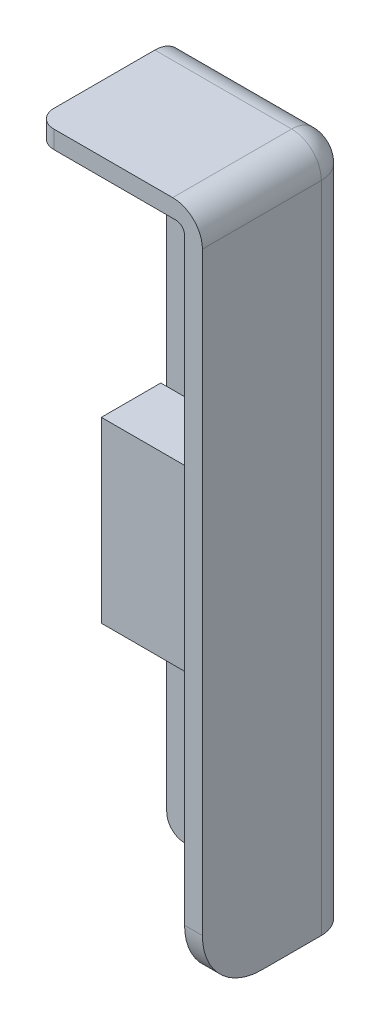
ISO-10303-21;
HEADER;
FILE_DESCRIPTION(('STEP AP214'),'2;1');
FILE_NAME('part.step','',(''),(''),'','','');
FILE_SCHEMA(('AUTOMOTIVE_DESIGN { 1 0 10303 214 1 1 1 1 }'));
ENDSEC;
DATA;
#1=APPLICATION_CONTEXT('core data for automotive mechanical design processes');
#2=APPLICATION_PROTOCOL_DEFINITION('international standard','automotive_design',2000,#1);
#3=PRODUCT_CONTEXT('',#1,'mechanical');
#4=PRODUCT('Part','Part','',(#3));
#5=PRODUCT_RELATED_PRODUCT_CATEGORY('part','',(#4));
#6=PRODUCT_DEFINITION_FORMATION('','',#4);
#7=PRODUCT_DEFINITION_CONTEXT('part definition',#1,'design');
#8=PRODUCT_DEFINITION('design','',#6,#7);
#9=PRODUCT_DEFINITION_SHAPE('','',#8);
#10=(LENGTH_UNIT() NAMED_UNIT(*) SI_UNIT(.MILLI.,.METRE.));
#11=(NAMED_UNIT(*) PLANE_ANGLE_UNIT() SI_UNIT($,.RADIAN.));
#12=(NAMED_UNIT(*) SI_UNIT($,.STERADIAN.) SOLID_ANGLE_UNIT());
#13=UNCERTAINTY_MEASURE_WITH_UNIT(LENGTH_MEASURE(1.E-05),#10,'distance_accuracy_value','');
#14=(GEOMETRIC_REPRESENTATION_CONTEXT(3) GLOBAL_UNCERTAINTY_ASSIGNED_CONTEXT((#13)) GLOBAL_UNIT_ASSIGNED_CONTEXT((#10,
#11,#12)) REPRESENTATION_CONTEXT('',''));
#15=CARTESIAN_POINT('',(0.,0.,0.));
#16=DIRECTION('',(0.,0.,1.));
#17=DIRECTION('',(1.,0.,0.));
#18=AXIS2_PLACEMENT_3D('',#15,#16,#17);
#19=CARTESIAN_POINT('',(11.,0.,0.));
#20=DIRECTION('',(1.,0.,0.));
#21=DIRECTION('',(0.,0.,-1.));
#22=AXIS2_PLACEMENT_3D('',#19,#20,#21);
#23=PLANE('',#22);
#24=CARTESIAN_POINT('',(11.,-42.9999999999999,1.49999999999996));
#25=DIRECTION('',(1.,0.,0.));
#26=DIRECTION('',(0.,0.,-1.));
#27=AXIS2_PLACEMENT_3D('',#24,#25,#26);
#28=CIRCLE('',#27,3.5);
#29=CARTESIAN_POINT('',(11.,-42.9999999999999,-2.00000000000004));
#30=VERTEX_POINT('',#29);
#31=EDGE_CURVE('E367',#30,#30,#28,.T.);
#32=ORIENTED_EDGE('',*,*,#31,.T.);
#33=EDGE_LOOP('',(#32));
#34=FACE_BOUND('',#33,.T.);
#35=DIRECTION('',(0.,-1.,0.));
#36=VECTOR('',#35,1.);
#37=CARTESIAN_POINT('',(11.,13.5,-6.50000000000002));
#38=LINE('',#37,#36);
#39=CARTESIAN_POINT('',(11.,-19.5,-6.50000000000002));
#40=VERTEX_POINT('',#39);
#41=CARTESIAN_POINT('',(11.,16.5,-6.50000000000002));
#42=VERTEX_POINT('',#41);
#43=EDGE_CURVE('E358',#40,#42,#38,.F.);
#44=ORIENTED_EDGE('',*,*,#43,.T.);
#45=DIRECTION('',(0.,0.,-1.));
#46=VECTOR('',#45,1.);
#47=CARTESIAN_POINT('',(11.,16.5,6.49999999999998));
#48=LINE('',#47,#46);
#49=CARTESIAN_POINT('',(11.,16.5,9.49999999999998));
#50=VERTEX_POINT('',#49);
#51=EDGE_CURVE('E360',#42,#50,#48,.F.);
#52=ORIENTED_EDGE('',*,*,#51,.T.);
#53=DIRECTION('',(0.,1.,0.));
#54=VECTOR('',#53,1.);
#55=CARTESIAN_POINT('',(11.,-16.5,9.49999999999998));
#56=LINE('',#55,#54);
#57=CARTESIAN_POINT('',(11.,-19.5,9.49999999999998));
#58=VERTEX_POINT('',#57);
#59=EDGE_CURVE('E354',#50,#58,#56,.F.);
#60=ORIENTED_EDGE('',*,*,#59,.T.);
#61=DIRECTION('',(0.,0.,1.));
#62=VECTOR('',#61,1.);
#63=CARTESIAN_POINT('',(11.,-19.5,-3.50000000000002));
#64=LINE('',#63,#62);
#65=EDGE_CURVE('E356',#58,#40,#64,.F.);
#66=ORIENTED_EDGE('',*,*,#65,.T.);
#67=EDGE_LOOP('',(#44,#52,#60,#66));
#68=FACE_BOUND('',#67,.T.);
#69=DIRECTION('',(0.,0.,-1.));
#70=VECTOR('',#69,1.);
#71=CARTESIAN_POINT('',(11.,-57.5,12.5));
#72=LINE('',#71,#70);
#73=CARTESIAN_POINT('',(11.,-57.5,2.49999999999999));
#74=VERTEX_POINT('',#73);
#75=CARTESIAN_POINT('',(11.,-57.5,-8.00000000000001));
#76=VERTEX_POINT('',#75);
#77=EDGE_CURVE('E241',#74,#76,#72,.T.);
#78=ORIENTED_EDGE('',*,*,#77,.F.);
#79=CARTESIAN_POINT('',(11.,-47.5,2.49999999999999));
#80=DIRECTION('',(1.,0.,0.));
#81=DIRECTION('',(0.,0.,-1.));
#82=AXIS2_PLACEMENT_3D('',#79,#80,#81);
#83=CIRCLE('',#82,10.);
#84=CARTESIAN_POINT('',(11.,-47.5,12.5));
#85=VERTEX_POINT('',#84);
#86=EDGE_CURVE('E327',#74,#85,#83,.F.);
#87=ORIENTED_EDGE('',*,*,#86,.T.);
#88=DIRECTION('',(0.,-1.,0.));
#89=VECTOR('',#88,1.);
#90=CARTESIAN_POINT('',(11.,-57.5,12.5));
#91=LINE('',#90,#89);
#92=CARTESIAN_POINT('',(11.,53.,12.5));
#93=VERTEX_POINT('',#92);
#94=EDGE_CURVE('E237',#93,#85,#91,.T.);
#95=ORIENTED_EDGE('',*,*,#94,.F.);
#96=DIRECTION('',(0.,0.,1.));
#97=VECTOR('',#96,1.);
#98=CARTESIAN_POINT('',(11.,53.,0.));
#99=LINE('',#98,#97);
#100=CARTESIAN_POINT('',(11.,53.,-8.00000000000001));
#101=VERTEX_POINT('',#100);
#102=EDGE_CURVE('E271',#93,#101,#99,.F.);
#103=ORIENTED_EDGE('',*,*,#102,.T.);
#104=DIRECTION('',(0.,1.,0.));
#105=VECTOR('',#104,1.);
#106=CARTESIAN_POINT('',(11.,0.,-8.00000000000001));
#107=LINE('',#106,#105);
#108=EDGE_CURVE('E273',#101,#76,#107,.F.);
#109=ORIENTED_EDGE('',*,*,#108,.T.);
#110=EDGE_LOOP('',(#78,#87,#95,#103,#109));
#111=FACE_BOUND('',#110,.T.);
#112=ADVANCED_FACE('F43',(#34,#68,#111),#23,.F.);
#113=CARTESIAN_POINT('',(14.,57.5,12.5));
#114=DIRECTION('',(0.,0.,-1.));
#115=DIRECTION('',(0.,1.,0.));
#116=AXIS2_PLACEMENT_3D('',#113,#114,#115);
#117=PLANE('',#116);
#118=DIRECTION('',(-1.,0.,0.));
#119=VECTOR('',#118,1.);
#120=CARTESIAN_POINT('',(14.,57.5,12.5));
#121=LINE('',#120,#119);
#122=CARTESIAN_POINT('',(9.,57.5,12.5));
#123=VERTEX_POINT('',#122);
#124=CARTESIAN_POINT('',(-11.,57.5,12.5));
#125=VERTEX_POINT('',#124);
#126=EDGE_CURVE('E262',#123,#125,#121,.T.);
#127=ORIENTED_EDGE('',*,*,#126,.T.);
#128=DIRECTION('',(0.,-1.,0.));
#129=VECTOR('',#128,1.);
#130=CARTESIAN_POINT('',(-11.,57.5,12.5));
#131=LINE('',#130,#129);
#132=CARTESIAN_POINT('',(-11.,54.5,12.5));
#133=VERTEX_POINT('',#132);
#134=EDGE_CURVE('E344',#125,#133,#131,.T.);
#135=ORIENTED_EDGE('',*,*,#134,.T.);
#136=DIRECTION('',(-1.,0.,0.));
#137=VECTOR('',#136,1.);
#138=CARTESIAN_POINT('',(128.140264587042,54.5,12.5));
#139=LINE('',#138,#137);
#140=CARTESIAN_POINT('',(9.49999999999999,54.5,12.5));
#141=VERTEX_POINT('',#140);
#142=EDGE_CURVE('E233',#141,#133,#139,.T.);
#143=ORIENTED_EDGE('',*,*,#142,.F.);
#144=CARTESIAN_POINT('',(9.49999999999999,53.,12.5));
#145=DIRECTION('',(0.,0.,-1.));
#146=DIRECTION('',(0.,1.,0.));
#147=AXIS2_PLACEMENT_3D('',#144,#145,#146);
#148=CIRCLE('',#147,1.5);
#149=EDGE_CURVE('E284',#141,#93,#148,.T.);
#150=ORIENTED_EDGE('',*,*,#149,.T.);
#151=ORIENTED_EDGE('',*,*,#94,.T.);
#152=DIRECTION('',(-1.,0.,0.));
#153=VECTOR('',#152,1.);
#154=CARTESIAN_POINT('',(14.,-47.5,12.5));
#155=LINE('',#154,#153);
#156=CARTESIAN_POINT('',(14.,-47.5,12.5));
#157=VERTEX_POINT('',#156);
#158=EDGE_CURVE('E329',#85,#157,#155,.F.);
#159=ORIENTED_EDGE('',*,*,#158,.T.);
#160=DIRECTION('',(0.,-1.,0.));
#161=VECTOR('',#160,1.);
#162=CARTESIAN_POINT('',(14.,57.5,12.5));
#163=LINE('',#162,#161);
#164=CARTESIAN_POINT('',(14.,52.5,12.5));
#165=VERTEX_POINT('',#164);
#166=EDGE_CURVE('E250',#165,#157,#163,.T.);
#167=ORIENTED_EDGE('',*,*,#166,.F.);
#168=CARTESIAN_POINT('',(9.,52.5,12.5));
#169=DIRECTION('',(0.,0.,-1.));
#170=DIRECTION('',(0.,1.,0.));
#171=AXIS2_PLACEMENT_3D('',#168,#169,#170);
#172=CIRCLE('',#171,5.);
#173=EDGE_CURVE('E310',#165,#123,#172,.F.);
#174=ORIENTED_EDGE('',*,*,#173,.T.);
#175=EDGE_LOOP('',(#127,#135,#143,#150,#151,#159,#167,#174));
#176=FACE_BOUND('',#175,.T.);
#177=ADVANCED_FACE('F395',(#176),#117,.F.);
#178=CARTESIAN_POINT('',(14.,-57.5,12.5));
#179=DIRECTION('',(0.,1.,0.));
#180=DIRECTION('',(0.,0.,1.));
#181=AXIS2_PLACEMENT_3D('',#178,#179,#180);
#182=PLANE('',#181);
#183=DIRECTION('',(-1.,0.,0.));
#184=VECTOR('',#183,1.);
#185=CARTESIAN_POINT('',(128.140264587042,-57.5,-9.50000000000001));
#186=LINE('',#185,#184);
#187=CARTESIAN_POINT('',(9.49999999999999,-57.5,-9.50000000000001));
#188=VERTEX_POINT('',#187);
#189=CARTESIAN_POINT('',(-11.,-57.5,-9.50000000000001));
#190=VERTEX_POINT('',#189);
#191=EDGE_CURVE('E240',#188,#190,#186,.T.);
#192=ORIENTED_EDGE('',*,*,#191,.T.);
#193=DIRECTION('',(0.,0.,-1.));
#194=VECTOR('',#193,1.);
#195=CARTESIAN_POINT('',(-11.,-57.5,12.5));
#196=LINE('',#195,#194);
#197=CARTESIAN_POINT('',(-11.,-57.5,-12.5));
#198=VERTEX_POINT('',#197);
#199=EDGE_CURVE('E333',#190,#198,#196,.T.);
#200=ORIENTED_EDGE('',*,*,#199,.T.);
#201=DIRECTION('',(-1.,0.,0.));
#202=VECTOR('',#201,1.);
#203=CARTESIAN_POINT('',(14.,-57.5,-12.5));
#204=LINE('',#203,#202);
#205=CARTESIAN_POINT('',(9.,-57.5,-12.5));
#206=VERTEX_POINT('',#205);
#207=EDGE_CURVE('E256',#206,#198,#204,.T.);
#208=ORIENTED_EDGE('',*,*,#207,.F.);
#209=CARTESIAN_POINT('',(9.,-57.5,-7.50000000000001));
#210=DIRECTION('',(0.,1.,0.));
#211=DIRECTION('',(0.,0.,1.));
#212=AXIS2_PLACEMENT_3D('',#209,#210,#211);
#213=CIRCLE('',#212,5.);
#214=CARTESIAN_POINT('',(14.,-57.5,-7.50000000000001));
#215=VERTEX_POINT('',#214);
#216=EDGE_CURVE('E312',#206,#215,#213,.F.);
#217=ORIENTED_EDGE('',*,*,#216,.T.);
#218=DIRECTION('',(0.,0.,-1.));
#219=VECTOR('',#218,1.);
#220=CARTESIAN_POINT('',(14.,-57.5,12.5));
#221=LINE('',#220,#219);
#222=CARTESIAN_POINT('',(14.,-57.5,2.49999999999999));
#223=VERTEX_POINT('',#222);
#224=EDGE_CURVE('E253',#223,#215,#221,.T.);
#225=ORIENTED_EDGE('',*,*,#224,.F.);
#226=DIRECTION('',(-1.,0.,0.));
#227=VECTOR('',#226,1.);
#228=CARTESIAN_POINT('',(14.,-57.5,2.49999999999999));
#229=LINE('',#228,#227);
#230=EDGE_CURVE('E315',#223,#74,#229,.T.);
#231=ORIENTED_EDGE('',*,*,#230,.T.);
#232=ORIENTED_EDGE('',*,*,#77,.T.);
#233=CARTESIAN_POINT('',(9.49999999999999,-57.5,-8.00000000000001));
#234=DIRECTION('',(0.,1.,0.));
#235=DIRECTION('',(0.,0.,1.));
#236=AXIS2_PLACEMENT_3D('',#233,#234,#235);
#237=CIRCLE('',#236,1.5);
#238=EDGE_CURVE('E280',#76,#188,#237,.T.);
#239=ORIENTED_EDGE('',*,*,#238,.T.);
#240=EDGE_LOOP('',(#192,#200,#208,#217,#225,#231,#232,#239));
#241=FACE_BOUND('',#240,.T.);
#242=ADVANCED_FACE('F405',(#241),#182,.F.);
#243=CARTESIAN_POINT('',(-14.,0.,0.));
#244=DIRECTION('',(1.,0.,0.));
#245=DIRECTION('',(0.,0.,-1.));
#246=AXIS2_PLACEMENT_3D('',#243,#244,#245);
#247=PLANE('',#246);
#248=DIRECTION('',(0.,1.,0.));
#249=VECTOR('',#248,1.);
#250=CARTESIAN_POINT('',(-14.,57.5,-12.5));
#251=LINE('',#250,#249);
#252=CARTESIAN_POINT('',(-14.,-54.5,-12.5));
#253=VERTEX_POINT('',#252);
#254=CARTESIAN_POINT('',(-14.,52.5,-12.5));
#255=VERTEX_POINT('',#254);
#256=EDGE_CURVE('E243',#253,#255,#251,.T.);
#257=ORIENTED_EDGE('',*,*,#256,.F.);
#258=DIRECTION('',(0.,0.,-1.));
#259=VECTOR('',#258,1.);
#260=CARTESIAN_POINT('',(-14.,-54.5,0.));
#261=LINE('',#260,#259);
#262=CARTESIAN_POINT('',(-14.,-54.5,-9.50000000000001));
#263=VERTEX_POINT('',#262);
#264=EDGE_CURVE('E340',#253,#263,#261,.F.);
#265=ORIENTED_EDGE('',*,*,#264,.T.);
#266=DIRECTION('',(0.,1.,0.));
#267=VECTOR('',#266,1.);
#268=CARTESIAN_POINT('',(-14.,-57.5,-9.50000000000001));
#269=LINE('',#268,#267);
#270=CARTESIAN_POINT('',(-14.,53.,-9.50000000000001));
#271=VERTEX_POINT('',#270);
#272=EDGE_CURVE('E238',#263,#271,#269,.T.);
#273=ORIENTED_EDGE('',*,*,#272,.T.);
#274=CARTESIAN_POINT('',(-14.,53.,-8.00000000000001));
#275=DIRECTION('',(1.,0.,0.));
#276=DIRECTION('',(0.,0.,-1.));
#277=AXIS2_PLACEMENT_3D('',#274,#275,#276);
#278=CIRCLE('',#277,1.5);
#279=CARTESIAN_POINT('',(-14.,54.5,-8.00000000000001));
#280=VERTEX_POINT('',#279);
#281=EDGE_CURVE('E282',#271,#280,#278,.T.);
#282=ORIENTED_EDGE('',*,*,#281,.T.);
#283=DIRECTION('',(0.,0.,1.));
#284=VECTOR('',#283,1.);
#285=CARTESIAN_POINT('',(-14.,54.5,12.5));
#286=LINE('',#285,#284);
#287=CARTESIAN_POINT('',(-14.,54.5,9.50000000000001));
#288=VERTEX_POINT('',#287);
#289=EDGE_CURVE('E234',#280,#288,#286,.T.);
#290=ORIENTED_EDGE('',*,*,#289,.T.);
#291=DIRECTION('',(0.,-1.,0.));
#292=VECTOR('',#291,1.);
#293=CARTESIAN_POINT('',(-14.,0.,9.5));
#294=LINE('',#293,#292);
#295=CARTESIAN_POINT('',(-14.,57.5,9.50000000000001));
#296=VERTEX_POINT('',#295);
#297=EDGE_CURVE('E338',#288,#296,#294,.F.);
#298=ORIENTED_EDGE('',*,*,#297,.T.);
#299=DIRECTION('',(0.,0.,1.));
#300=VECTOR('',#299,1.);
#301=CARTESIAN_POINT('',(-14.,57.5,12.5));
#302=LINE('',#301,#300);
#303=CARTESIAN_POINT('',(-14.,57.5,-7.49999999999999));
#304=VERTEX_POINT('',#303);
#305=EDGE_CURVE('E254',#304,#296,#302,.T.);
#306=ORIENTED_EDGE('',*,*,#305,.F.);
#307=CARTESIAN_POINT('',(-14.,52.5,-7.49999999999999));
#308=DIRECTION('',(1.,0.,0.));
#309=DIRECTION('',(0.,0.,-1.));
#310=AXIS2_PLACEMENT_3D('',#307,#308,#309);
#311=CIRCLE('',#310,5.);
#312=EDGE_CURVE('E299',#304,#255,#311,.F.);
#313=ORIENTED_EDGE('',*,*,#312,.T.);
#314=EDGE_LOOP('',(#257,#265,#273,#282,#290,#298,#306,#313));
#315=FACE_BOUND('',#314,.T.);
#316=ADVANCED_FACE('F443',(#315),#247,.F.);
#317=CARTESIAN_POINT('',(14.,57.5,-12.5));
#318=DIRECTION('',(0.,0.,1.));
#319=DIRECTION('',(0.,-1.,0.));
#320=AXIS2_PLACEMENT_3D('',#317,#318,#319);
#321=PLANE('',#320);
#322=ORIENTED_EDGE('',*,*,#207,.T.);
#323=CARTESIAN_POINT('',(-11.,-54.5,-12.5));
#324=DIRECTION('',(0.,0.,1.));
#325=DIRECTION('',(0.,-1.,0.));
#326=AXIS2_PLACEMENT_3D('',#323,#324,#325);
#327=CIRCLE('',#326,3.);
#328=EDGE_CURVE('E336',#198,#253,#327,.F.);
#329=ORIENTED_EDGE('',*,*,#328,.T.);
#330=ORIENTED_EDGE('',*,*,#256,.T.);
#331=DIRECTION('',(-1.,0.,0.));
#332=VECTOR('',#331,1.);
#333=CARTESIAN_POINT('',(14.,52.5,-12.5));
#334=LINE('',#333,#332);
#335=CARTESIAN_POINT('',(9.,52.5,-12.5));
#336=VERTEX_POINT('',#335);
#337=EDGE_CURVE('E304',#255,#336,#334,.F.);
#338=ORIENTED_EDGE('',*,*,#337,.T.);
#339=DIRECTION('',(0.,1.,0.));
#340=VECTOR('',#339,1.);
#341=CARTESIAN_POINT('',(9.,-57.5,-12.5));
#342=LINE('',#341,#340);
#343=EDGE_CURVE('E302',#336,#206,#342,.F.);
#344=ORIENTED_EDGE('',*,*,#343,.T.);
#345=EDGE_LOOP('',(#322,#329,#330,#338,#344));
#346=FACE_BOUND('',#345,.T.);
#347=ADVANCED_FACE('F480',(#346),#321,.F.);
#348=CARTESIAN_POINT('',(14.,57.5,12.5));
#349=DIRECTION('',(0.,-1.,0.));
#350=DIRECTION('',(0.,0.,-1.));
#351=AXIS2_PLACEMENT_3D('',#348,#349,#350);
#352=PLANE('',#351);
#353=ORIENTED_EDGE('',*,*,#305,.T.);
#354=CARTESIAN_POINT('',(-11.,57.5,9.50000000000001));
#355=DIRECTION('',(0.,-1.,0.));
#356=DIRECTION('',(0.,0.,-1.));
#357=AXIS2_PLACEMENT_3D('',#354,#355,#356);
#358=CIRCLE('',#357,3.);
#359=EDGE_CURVE('E349',#296,#125,#358,.F.);
#360=ORIENTED_EDGE('',*,*,#359,.T.);
#361=ORIENTED_EDGE('',*,*,#126,.F.);
#362=DIRECTION('',(0.,0.,1.));
#363=VECTOR('',#362,1.);
#364=CARTESIAN_POINT('',(9.,57.5,-12.5));
#365=LINE('',#364,#363);
#366=CARTESIAN_POINT('',(9.,57.5,-7.49999999999999));
#367=VERTEX_POINT('',#366);
#368=EDGE_CURVE('E286',#123,#367,#365,.F.);
#369=ORIENTED_EDGE('',*,*,#368,.T.);
#370=DIRECTION('',(-1.,0.,0.));
#371=VECTOR('',#370,1.);
#372=CARTESIAN_POINT('',(14.,57.5,-7.49999999999999));
#373=LINE('',#372,#371);
#374=EDGE_CURVE('E296',#367,#304,#373,.T.);
#375=ORIENTED_EDGE('',*,*,#374,.T.);
#376=EDGE_LOOP('',(#353,#360,#361,#369,#375));
#377=FACE_BOUND('',#376,.T.);
#378=ADVANCED_FACE('F438',(#377),#352,.F.);
#379=CARTESIAN_POINT('',(14.,0.,0.));
#380=DIRECTION('',(1.,0.,0.));
#381=DIRECTION('',(0.,0.,-1.));
#382=AXIS2_PLACEMENT_3D('',#379,#380,#381);
#383=PLANE('',#382);
#384=ORIENTED_EDGE('',*,*,#166,.T.);
#385=CARTESIAN_POINT('',(14.,-47.5,2.49999999999999));
#386=DIRECTION('',(1.,0.,0.));
#387=DIRECTION('',(0.,0.,-1.));
#388=AXIS2_PLACEMENT_3D('',#385,#386,#387);
#389=CIRCLE('',#388,10.);
#390=EDGE_CURVE('E331',#157,#223,#389,.T.);
#391=ORIENTED_EDGE('',*,*,#390,.T.);
#392=ORIENTED_EDGE('',*,*,#224,.T.);
#393=DIRECTION('',(0.,1.,0.));
#394=VECTOR('',#393,1.);
#395=CARTESIAN_POINT('',(14.,57.5,-7.5));
#396=LINE('',#395,#394);
#397=CARTESIAN_POINT('',(14.,52.5,-7.5));
#398=VERTEX_POINT('',#397);
#399=EDGE_CURVE('E306',#215,#398,#396,.T.);
#400=ORIENTED_EDGE('',*,*,#399,.T.);
#401=DIRECTION('',(0.,0.,1.));
#402=VECTOR('',#401,1.);
#403=CARTESIAN_POINT('',(14.,52.5,12.5));
#404=LINE('',#403,#402);
#405=EDGE_CURVE('E308',#398,#165,#404,.T.);
#406=ORIENTED_EDGE('',*,*,#405,.T.);
#407=EDGE_LOOP('',(#384,#391,#392,#400,#406));
#408=FACE_BOUND('',#407,.T.);
#409=ADVANCED_FACE('F417',(#408),#383,.T.);
#410=CARTESIAN_POINT('',(128.140264587042,-57.5,-9.50000000000001));
#411=DIRECTION('',(0.,0.,1.));
#412=DIRECTION('',(1.,0.,0.));
#413=AXIS2_PLACEMENT_3D('',#410,#411,#412);
#414=PLANE('',#413);
#415=ORIENTED_EDGE('',*,*,#272,.F.);
#416=CARTESIAN_POINT('',(-11.,-54.5,-9.50000000000001));
#417=DIRECTION('',(0.,0.,1.));
#418=DIRECTION('',(1.,0.,0.));
#419=AXIS2_PLACEMENT_3D('',#416,#417,#418);
#420=CIRCLE('',#419,3.);
#421=EDGE_CURVE('E342',#263,#190,#420,.T.);
#422=ORIENTED_EDGE('',*,*,#421,.T.);
#423=ORIENTED_EDGE('',*,*,#191,.F.);
#424=DIRECTION('',(0.,1.,0.));
#425=VECTOR('',#424,1.);
#426=CARTESIAN_POINT('',(9.49999999999999,-57.5,-9.50000000000001));
#427=LINE('',#426,#425);
#428=CARTESIAN_POINT('',(9.49999999999999,53.,-9.50000000000001));
#429=VERTEX_POINT('',#428);
#430=EDGE_CURVE('E268',#188,#429,#427,.T.);
#431=ORIENTED_EDGE('',*,*,#430,.T.);
#432=DIRECTION('',(-1.,0.,0.));
#433=VECTOR('',#432,1.);
#434=CARTESIAN_POINT('',(-14.,53.,-9.50000000000001));
#435=LINE('',#434,#433);
#436=EDGE_CURVE('E265',#429,#271,#435,.T.);
#437=ORIENTED_EDGE('',*,*,#436,.T.);
#438=EDGE_LOOP('',(#415,#422,#423,#431,#437));
#439=FACE_BOUND('',#438,.T.);
#440=ADVANCED_FACE('F472',(#439),#414,.T.);
#441=CARTESIAN_POINT('',(128.140264587042,54.5,12.5));
#442=DIRECTION('',(0.,-1.,0.));
#443=DIRECTION('',(0.,0.,-1.));
#444=AXIS2_PLACEMENT_3D('',#441,#442,#443);
#445=PLANE('',#444);
#446=ORIENTED_EDGE('',*,*,#142,.T.);
#447=CARTESIAN_POINT('',(-11.,54.5,9.50000000000001));
#448=DIRECTION('',(0.,-1.,0.));
#449=DIRECTION('',(0.,0.,-1.));
#450=AXIS2_PLACEMENT_3D('',#447,#448,#449);
#451=CIRCLE('',#450,3.);
#452=EDGE_CURVE('E347',#133,#288,#451,.T.);
#453=ORIENTED_EDGE('',*,*,#452,.T.);
#454=ORIENTED_EDGE('',*,*,#289,.F.);
#455=DIRECTION('',(-1.,0.,0.));
#456=VECTOR('',#455,1.);
#457=CARTESIAN_POINT('',(11.,54.5,-8.00000000000001));
#458=LINE('',#457,#456);
#459=CARTESIAN_POINT('',(9.49999999999999,54.5,-8.00000000000001));
#460=VERTEX_POINT('',#459);
#461=EDGE_CURVE('E278',#280,#460,#458,.F.);
#462=ORIENTED_EDGE('',*,*,#461,.T.);
#463=DIRECTION('',(0.,0.,1.));
#464=VECTOR('',#463,1.);
#465=CARTESIAN_POINT('',(9.49999999999999,54.5,12.5));
#466=LINE('',#465,#464);
#467=EDGE_CURVE('E276',#460,#141,#466,.T.);
#468=ORIENTED_EDGE('',*,*,#467,.T.);
#469=EDGE_LOOP('',(#446,#453,#454,#462,#468));
#470=FACE_BOUND('',#469,.T.);
#471=ADVANCED_FACE('F452',(#470),#445,.T.);
#472=CARTESIAN_POINT('',(-9.,13.5,6.49999999999998));
#473=DIRECTION('',(0.,0.,-1.));
#474=DIRECTION('',(0.,1.,0.));
#475=AXIS2_PLACEMENT_3D('',#472,#473,#474);
#476=PLANE('',#475);
#477=DIRECTION('',(1.,0.,0.));
#478=VECTOR('',#477,1.);
#479=CARTESIAN_POINT('',(-9.,-16.5,6.49999999999998));
#480=LINE('',#479,#478);
#481=CARTESIAN_POINT('',(-9.,-16.5,6.49999999999998));
#482=VERTEX_POINT('',#481);
#483=CARTESIAN_POINT('',(8.,-16.5,6.49999999999998));
#484=VERTEX_POINT('',#483);
#485=EDGE_CURVE('E224',#482,#484,#480,.T.);
#486=ORIENTED_EDGE('',*,*,#485,.T.);
#487=DIRECTION('',(0.,1.,0.));
#488=VECTOR('',#487,1.);
#489=CARTESIAN_POINT('',(8.,13.5,6.49999999999998));
#490=LINE('',#489,#488);
#491=CARTESIAN_POINT('',(8.,13.5,6.49999999999998));
#492=VERTEX_POINT('',#491);
#493=EDGE_CURVE('E365',#484,#492,#490,.T.);
#494=ORIENTED_EDGE('',*,*,#493,.T.);
#495=DIRECTION('',(1.,0.,0.));
#496=VECTOR('',#495,1.);
#497=CARTESIAN_POINT('',(-9.,13.5,6.49999999999998));
#498=LINE('',#497,#496);
#499=CARTESIAN_POINT('',(-9.,13.5,6.49999999999998));
#500=VERTEX_POINT('',#499);
#501=EDGE_CURVE('E230',#500,#492,#498,.T.);
#502=ORIENTED_EDGE('',*,*,#501,.F.);
#503=DIRECTION('',(0.,1.,0.));
#504=VECTOR('',#503,1.);
#505=CARTESIAN_POINT('',(-9.,13.5,6.49999999999998));
#506=LINE('',#505,#504);
#507=EDGE_CURVE('E215',#482,#500,#506,.T.);
#508=ORIENTED_EDGE('',*,*,#507,.F.);
#509=EDGE_LOOP('',(#486,#494,#502,#508));
#510=FACE_BOUND('',#509,.T.);
#511=ADVANCED_FACE('F540',(#510),#476,.F.);
#512=CARTESIAN_POINT('',(-9.,13.5,-3.50000000000002));
#513=DIRECTION('',(0.,-1.,0.));
#514=DIRECTION('',(0.,0.,-1.));
#515=AXIS2_PLACEMENT_3D('',#512,#513,#514);
#516=PLANE('',#515);
#517=ORIENTED_EDGE('',*,*,#501,.T.);
#518=DIRECTION('',(0.,0.,-1.));
#519=VECTOR('',#518,1.);
#520=CARTESIAN_POINT('',(8.,13.5,-3.50000000000002));
#521=LINE('',#520,#519);
#522=CARTESIAN_POINT('',(8.,13.5,-3.50000000000002));
#523=VERTEX_POINT('',#522);
#524=EDGE_CURVE('E351',#492,#523,#521,.T.);
#525=ORIENTED_EDGE('',*,*,#524,.T.);
#526=DIRECTION('',(1.,0.,0.));
#527=VECTOR('',#526,1.);
#528=CARTESIAN_POINT('',(-9.,13.5,-3.50000000000002));
#529=LINE('',#528,#527);
#530=CARTESIAN_POINT('',(-9.,13.5,-3.50000000000002));
#531=VERTEX_POINT('',#530);
#532=EDGE_CURVE('E228',#531,#523,#529,.T.);
#533=ORIENTED_EDGE('',*,*,#532,.F.);
#534=DIRECTION('',(0.,0.,-1.));
#535=VECTOR('',#534,1.);
#536=CARTESIAN_POINT('',(-9.,13.5,-3.50000000000002));
#537=LINE('',#536,#535);
#538=EDGE_CURVE('E218',#500,#531,#537,.T.);
#539=ORIENTED_EDGE('',*,*,#538,.F.);
#540=EDGE_LOOP('',(#517,#525,#533,#539));
#541=FACE_BOUND('',#540,.T.);
#542=ADVANCED_FACE('F543',(#541),#516,.F.);
#543=CARTESIAN_POINT('',(-9.,13.5,-3.50000000000002));
#544=DIRECTION('',(0.,0.,1.));
#545=DIRECTION('',(0.,-1.,0.));
#546=AXIS2_PLACEMENT_3D('',#543,#544,#545);
#547=PLANE('',#546);
#548=ORIENTED_EDGE('',*,*,#532,.T.);
#549=DIRECTION('',(0.,-1.,0.));
#550=VECTOR('',#549,1.);
#551=CARTESIAN_POINT('',(8.,-16.5,-3.50000000000002));
#552=LINE('',#551,#550);
#553=CARTESIAN_POINT('',(8.,-16.5,-3.50000000000002));
#554=VERTEX_POINT('',#553);
#555=EDGE_CURVE('E66',#523,#554,#552,.T.);
#556=ORIENTED_EDGE('',*,*,#555,.T.);
#557=DIRECTION('',(1.,0.,0.));
#558=VECTOR('',#557,1.);
#559=CARTESIAN_POINT('',(-9.,-16.5,-3.50000000000002));
#560=LINE('',#559,#558);
#561=CARTESIAN_POINT('',(-9.,-16.5,-3.50000000000002));
#562=VERTEX_POINT('',#561);
#563=EDGE_CURVE('E226',#562,#554,#560,.T.);
#564=ORIENTED_EDGE('',*,*,#563,.F.);
#565=DIRECTION('',(0.,-1.,0.));
#566=VECTOR('',#565,1.);
#567=CARTESIAN_POINT('',(-9.,13.5,-3.50000000000002));
#568=LINE('',#567,#566);
#569=EDGE_CURVE('E220',#531,#562,#568,.T.);
#570=ORIENTED_EDGE('',*,*,#569,.F.);
#571=EDGE_LOOP('',(#548,#556,#564,#570));
#572=FACE_BOUND('',#571,.T.);
#573=ADVANCED_FACE('F551',(#572),#547,.F.);
#574=CARTESIAN_POINT('',(-9.,-16.5,-3.50000000000002));
#575=DIRECTION('',(0.,1.,0.));
#576=DIRECTION('',(0.,0.,1.));
#577=AXIS2_PLACEMENT_3D('',#574,#575,#576);
#578=PLANE('',#577);
#579=ORIENTED_EDGE('',*,*,#563,.T.);
#580=DIRECTION('',(0.,0.,1.));
#581=VECTOR('',#580,1.);
#582=CARTESIAN_POINT('',(8.,-16.5,6.49999999999998));
#583=LINE('',#582,#581);
#584=EDGE_CURVE('E58',#554,#484,#583,.T.);
#585=ORIENTED_EDGE('',*,*,#584,.T.);
#586=ORIENTED_EDGE('',*,*,#485,.F.);
#587=DIRECTION('',(0.,0.,1.));
#588=VECTOR('',#587,1.);
#589=CARTESIAN_POINT('',(-9.,-16.5,-3.50000000000002));
#590=LINE('',#589,#588);
#591=EDGE_CURVE('E222',#562,#482,#590,.T.);
#592=ORIENTED_EDGE('',*,*,#591,.F.);
#593=EDGE_LOOP('',(#579,#585,#586,#592));
#594=FACE_BOUND('',#593,.T.);
#595=ADVANCED_FACE('F549',(#594),#578,.F.);
#596=CARTESIAN_POINT('',(-9.,0.,0.));
#597=DIRECTION('',(-1.,0.,0.));
#598=DIRECTION('',(0.,0.,1.));
#599=AXIS2_PLACEMENT_3D('',#596,#597,#598);
#600=PLANE('',#599);
#601=CARTESIAN_POINT('',(-9.,8.5,1.49999999999998));
#602=DIRECTION('',(-1.,0.,0.));
#603=DIRECTION('',(0.,0.,1.));
#604=AXIS2_PLACEMENT_3D('',#601,#602,#603);
#605=CIRCLE('',#604,1.13029999999999);
#606=CARTESIAN_POINT('',(-9.,8.5,2.63029999999997));
#607=VERTEX_POINT('',#606);
#608=EDGE_CURVE('E204',#607,#607,#605,.T.);
#609=ORIENTED_EDGE('',*,*,#608,.F.);
#610=EDGE_LOOP('',(#609));
#611=FACE_BOUND('',#610,.T.);
#612=CARTESIAN_POINT('',(-9.,-11.5,1.49999999999998));
#613=DIRECTION('',(-1.,0.,0.));
#614=DIRECTION('',(0.,0.,1.));
#615=AXIS2_PLACEMENT_3D('',#612,#613,#614);
#616=CIRCLE('',#615,1.13029999999999);
#617=CARTESIAN_POINT('',(-9.,-11.5,2.63029999999997));
#618=VERTEX_POINT('',#617);
#619=EDGE_CURVE('E203',#618,#618,#616,.T.);
#620=ORIENTED_EDGE('',*,*,#619,.F.);
#621=EDGE_LOOP('',(#620));
#622=FACE_BOUND('',#621,.T.);
#623=ORIENTED_EDGE('',*,*,#507,.T.);
#624=ORIENTED_EDGE('',*,*,#538,.T.);
#625=ORIENTED_EDGE('',*,*,#569,.T.);
#626=ORIENTED_EDGE('',*,*,#591,.T.);
#627=EDGE_LOOP('',(#623,#624,#625,#626));
#628=FACE_BOUND('',#627,.T.);
#629=ADVANCED_FACE('F547',(#611,#622,#628),#600,.T.);
#630=CARTESIAN_POINT('',(-2.65,-11.5,1.49999999999998));
#631=DIRECTION('',(-1.,0.,0.));
#632=DIRECTION('',(0.,0.,1.));
#633=AXIS2_PLACEMENT_3D('',#630,#631,#632);
#634=CONICAL_SURFACE('',#633,1.1303,1.02974425867665);
#635=CARTESIAN_POINT('',(-1.97084724231315,-11.5,1.49999999999998));
#636=VERTEX_POINT('',#635);
#637=VERTEX_LOOP('',#636);
#638=FACE_BOUND('',#637,.T.);
#639=CARTESIAN_POINT('',(-2.65,-11.5,1.49999999999998));
#640=DIRECTION('',(-1.,0.,0.));
#641=DIRECTION('',(0.,0.,1.));
#642=AXIS2_PLACEMENT_3D('',#639,#640,#641);
#643=CIRCLE('',#642,1.1303);
#644=CARTESIAN_POINT('',(-2.65,-11.5,2.63029999999998));
#645=VERTEX_POINT('',#644);
#646=EDGE_CURVE('E207',#645,#645,#643,.T.);
#647=ORIENTED_EDGE('',*,*,#646,.T.);
#648=EDGE_LOOP('',(#647));
#649=FACE_BOUND('',#648,.T.);
#650=ADVANCED_FACE('F557',(#638,#649),#634,.F.);
#651=CARTESIAN_POINT('',(-9.,-11.5,1.49999999999998));
#652=DIRECTION('',(-1.,0.,0.));
#653=DIRECTION('',(0.,0.,1.));
#654=AXIS2_PLACEMENT_3D('',#651,#652,#653);
#655=CYLINDRICAL_SURFACE('',#654,1.13029999999999);
#656=ORIENTED_EDGE('',*,*,#646,.F.);
#657=EDGE_LOOP('',(#656));
#658=FACE_BOUND('',#657,.T.);
#659=ORIENTED_EDGE('',*,*,#619,.T.);
#660=EDGE_LOOP('',(#659));
#661=FACE_BOUND('',#660,.T.);
#662=ADVANCED_FACE('F197',(#658,#661),#655,.F.);
#663=CARTESIAN_POINT('',(-2.65,8.5,1.49999999999998));
#664=DIRECTION('',(-1.,0.,0.));
#665=DIRECTION('',(0.,0.,1.));
#666=AXIS2_PLACEMENT_3D('',#663,#664,#665);
#667=CONICAL_SURFACE('',#666,1.1303,1.02974425867665);
#668=CARTESIAN_POINT('',(-1.97084724231315,8.49999999999999,1.49999999999998));
#669=VERTEX_POINT('',#668);
#670=VERTEX_LOOP('',#669);
#671=FACE_BOUND('',#670,.T.);
#672=CARTESIAN_POINT('',(-2.65,8.5,1.49999999999998));
#673=DIRECTION('',(-1.,0.,0.));
#674=DIRECTION('',(0.,0.,1.));
#675=AXIS2_PLACEMENT_3D('',#672,#673,#674);
#676=CIRCLE('',#675,1.1303);
#677=CARTESIAN_POINT('',(-2.65,8.5,2.63029999999998));
#678=VERTEX_POINT('',#677);
#679=EDGE_CURVE('E201',#678,#678,#676,.T.);
#680=ORIENTED_EDGE('',*,*,#679,.T.);
#681=EDGE_LOOP('',(#680));
#682=FACE_BOUND('',#681,.T.);
#683=ADVANCED_FACE('F193',(#671,#682),#667,.F.);
#684=CARTESIAN_POINT('',(-9.,8.5,1.49999999999998));
#685=DIRECTION('',(-1.,0.,0.));
#686=DIRECTION('',(0.,0.,1.));
#687=AXIS2_PLACEMENT_3D('',#684,#685,#686);
#688=CYLINDRICAL_SURFACE('',#687,1.13029999999999);
#689=ORIENTED_EDGE('',*,*,#679,.F.);
#690=EDGE_LOOP('',(#689));
#691=FACE_BOUND('',#690,.T.);
#692=ORIENTED_EDGE('',*,*,#608,.T.);
#693=EDGE_LOOP('',(#692));
#694=FACE_BOUND('',#693,.T.);
#695=ADVANCED_FACE('F196',(#691,#694),#688,.F.);
#696=CARTESIAN_POINT('',(128.140264587042,53.,-8.00000000000001));
#697=DIRECTION('',(1.,0.,0.));
#698=DIRECTION('',(0.,0.,-1.));
#699=AXIS2_PLACEMENT_3D('',#696,#697,#698);
#700=CYLINDRICAL_SURFACE('',#699,1.5);
#701=ORIENTED_EDGE('',*,*,#281,.F.);
#702=ORIENTED_EDGE('',*,*,#436,.F.);
#703=CARTESIAN_POINT('',(9.49999999999999,53.,-8.00000000000001));
#704=DIRECTION('',(-1.,0.,0.));
#705=DIRECTION('',(0.,0.,1.));
#706=AXIS2_PLACEMENT_3D('',#703,#704,#705);
#707=CIRCLE('',#706,1.5);
#708=EDGE_CURVE('E210',#460,#429,#707,.T.);
#709=ORIENTED_EDGE('',*,*,#708,.F.);
#710=ORIENTED_EDGE('',*,*,#461,.F.);
#711=EDGE_LOOP('',(#701,#702,#709,#710));
#712=FACE_BOUND('',#711,.T.);
#713=ADVANCED_FACE('F463',(#712),#700,.F.);
#714=CARTESIAN_POINT('',(9.49999999999999,53.,12.5));
#715=DIRECTION('',(0.,0.,1.));
#716=DIRECTION('',(1.,0.,0.));
#717=AXIS2_PLACEMENT_3D('',#714,#715,#716);
#718=CYLINDRICAL_SURFACE('',#717,1.5);
#719=ORIENTED_EDGE('',*,*,#149,.F.);
#720=ORIENTED_EDGE('',*,*,#467,.F.);
#721=CARTESIAN_POINT('',(9.5,53.,-8.00000000000001));
#722=DIRECTION('',(0.,0.,1.));
#723=DIRECTION('',(1.,0.,0.));
#724=AXIS2_PLACEMENT_3D('',#721,#722,#723);
#725=CIRCLE('',#724,1.5);
#726=EDGE_CURVE('E289',#101,#460,#725,.T.);
#727=ORIENTED_EDGE('',*,*,#726,.F.);
#728=ORIENTED_EDGE('',*,*,#102,.F.);
#729=EDGE_LOOP('',(#719,#720,#727,#728));
#730=FACE_BOUND('',#729,.T.);
#731=ADVANCED_FACE('F458',(#730),#718,.F.);
#732=CARTESIAN_POINT('',(9.5,53.,-8.00000000000001));
#733=DIRECTION('',(0.,0.,1.));
#734=DIRECTION('',(1.,0.,0.));
#735=AXIS2_PLACEMENT_3D('',#732,#733,#734);
#736=SPHERICAL_SURFACE('',#735,1.5);
#737=ORIENTED_EDGE('',*,*,#726,.T.);
#738=ORIENTED_EDGE('',*,*,#708,.T.);
#739=CARTESIAN_POINT('',(9.49999999999999,53.,-8.00000000000001));
#740=DIRECTION('',(0.,-1.,0.));
#741=DIRECTION('',(0.,0.,-1.));
#742=AXIS2_PLACEMENT_3D('',#739,#740,#741);
#743=CIRCLE('',#742,1.5);
#744=EDGE_CURVE('E287',#101,#429,#743,.F.);
#745=ORIENTED_EDGE('',*,*,#744,.F.);
#746=EDGE_LOOP('',(#737,#738,#745));
#747=FACE_BOUND('',#746,.T.);
#748=ADVANCED_FACE('F466',(#747),#736,.F.);
#749=CARTESIAN_POINT('',(9.49999999999999,-57.5,-8.00000000000001));
#750=DIRECTION('',(0.,1.,0.));
#751=DIRECTION('',(0.,0.,1.));
#752=AXIS2_PLACEMENT_3D('',#749,#750,#751);
#753=CYLINDRICAL_SURFACE('',#752,1.5);
#754=ORIENTED_EDGE('',*,*,#238,.F.);
#755=ORIENTED_EDGE('',*,*,#108,.F.);
#756=ORIENTED_EDGE('',*,*,#744,.T.);
#757=ORIENTED_EDGE('',*,*,#430,.F.);
#758=EDGE_LOOP('',(#754,#755,#756,#757));
#759=FACE_BOUND('',#758,.T.);
#760=ADVANCED_FACE('F469',(#759),#753,.F.);
#761=CARTESIAN_POINT('',(9.,0.,-7.5));
#762=DIRECTION('',(0.,-1.,0.));
#763=DIRECTION('',(0.,0.,-1.));
#764=AXIS2_PLACEMENT_3D('',#761,#762,#763);
#765=CYLINDRICAL_SURFACE('',#764,5.);
#766=ORIENTED_EDGE('',*,*,#216,.F.);
#767=ORIENTED_EDGE('',*,*,#343,.F.);
#768=CARTESIAN_POINT('',(9.,52.5,-7.5));
#769=DIRECTION('',(0.,1.,0.));
#770=DIRECTION('',(0.,0.,1.));
#771=AXIS2_PLACEMENT_3D('',#768,#769,#770);
#772=CIRCLE('',#771,5.);
#773=EDGE_CURVE('E290',#398,#336,#772,.T.);
#774=ORIENTED_EDGE('',*,*,#773,.F.);
#775=ORIENTED_EDGE('',*,*,#399,.F.);
#776=EDGE_LOOP('',(#766,#767,#774,#775));
#777=FACE_BOUND('',#776,.T.);
#778=ADVANCED_FACE('F429',(#777),#765,.T.);
#779=CARTESIAN_POINT('',(9.,52.5,0.));
#780=DIRECTION('',(0.,0.,-1.));
#781=DIRECTION('',(-1.,0.,0.));
#782=AXIS2_PLACEMENT_3D('',#779,#780,#781);
#783=CYLINDRICAL_SURFACE('',#782,5.);
#784=ORIENTED_EDGE('',*,*,#173,.F.);
#785=ORIENTED_EDGE('',*,*,#405,.F.);
#786=CARTESIAN_POINT('',(9.,52.5,-7.49999999999999));
#787=DIRECTION('',(0.,0.,-1.));
#788=DIRECTION('',(-1.,0.,0.));
#789=AXIS2_PLACEMENT_3D('',#786,#787,#788);
#790=CIRCLE('',#789,5.);
#791=EDGE_CURVE('E319',#367,#398,#790,.T.);
#792=ORIENTED_EDGE('',*,*,#791,.F.);
#793=ORIENTED_EDGE('',*,*,#368,.F.);
#794=EDGE_LOOP('',(#784,#785,#792,#793));
#795=FACE_BOUND('',#794,.T.);
#796=ADVANCED_FACE('F423',(#795),#783,.T.);
#797=CARTESIAN_POINT('',(9.,52.5,-7.5));
#798=DIRECTION('',(0.,0.,1.));
#799=DIRECTION('',(1.,0.,0.));
#800=AXIS2_PLACEMENT_3D('',#797,#798,#799);
#801=SPHERICAL_SURFACE('',#800,5.);
#802=ORIENTED_EDGE('',*,*,#791,.T.);
#803=ORIENTED_EDGE('',*,*,#773,.T.);
#804=CARTESIAN_POINT('',(9.,52.5,-7.5));
#805=DIRECTION('',(1.,0.,0.));
#806=DIRECTION('',(0.,0.,-1.));
#807=AXIS2_PLACEMENT_3D('',#804,#805,#806);
#808=CIRCLE('',#807,5.);
#809=EDGE_CURVE('E316',#367,#336,#808,.F.);
#810=ORIENTED_EDGE('',*,*,#809,.F.);
#811=EDGE_LOOP('',(#802,#803,#810));
#812=FACE_BOUND('',#811,.T.);
#813=ADVANCED_FACE('F431',(#812),#801,.T.);
#814=CARTESIAN_POINT('',(14.,52.5,-7.49999999999999));
#815=DIRECTION('',(-1.,0.,0.));
#816=DIRECTION('',(0.,0.,1.));
#817=AXIS2_PLACEMENT_3D('',#814,#815,#816);
#818=CYLINDRICAL_SURFACE('',#817,5.);
#819=ORIENTED_EDGE('',*,*,#809,.T.);
#820=ORIENTED_EDGE('',*,*,#337,.F.);
#821=ORIENTED_EDGE('',*,*,#312,.F.);
#822=ORIENTED_EDGE('',*,*,#374,.F.);
#823=EDGE_LOOP('',(#819,#820,#821,#822));
#824=FACE_BOUND('',#823,.T.);
#825=ADVANCED_FACE('F435',(#824),#818,.T.);
#826=CARTESIAN_POINT('',(14.,-47.5,2.49999999999999));
#827=DIRECTION('',(-1.,0.,0.));
#828=DIRECTION('',(0.,0.,1.));
#829=AXIS2_PLACEMENT_3D('',#826,#827,#828);
#830=CYLINDRICAL_SURFACE('',#829,10.);
#831=ORIENTED_EDGE('',*,*,#390,.F.);
#832=ORIENTED_EDGE('',*,*,#158,.F.);
#833=ORIENTED_EDGE('',*,*,#86,.F.);
#834=ORIENTED_EDGE('',*,*,#230,.F.);
#835=EDGE_LOOP('',(#831,#832,#833,#834));
#836=FACE_BOUND('',#835,.T.);
#837=ADVANCED_FACE('F411',(#836),#830,.T.);
#838=CARTESIAN_POINT('',(-11.,-54.5,12.5));
#839=DIRECTION('',(0.,0.,-1.));
#840=DIRECTION('',(-1.,0.,0.));
#841=AXIS2_PLACEMENT_3D('',#838,#839,#840);
#842=CYLINDRICAL_SURFACE('',#841,3.);
#843=ORIENTED_EDGE('',*,*,#421,.F.);
#844=ORIENTED_EDGE('',*,*,#264,.F.);
#845=ORIENTED_EDGE('',*,*,#328,.F.);
#846=ORIENTED_EDGE('',*,*,#199,.F.);
#847=EDGE_LOOP('',(#843,#844,#845,#846));
#848=FACE_BOUND('',#847,.T.);
#849=ADVANCED_FACE('F477',(#848),#842,.T.);
#850=CARTESIAN_POINT('',(-11.,57.5,9.50000000000001));
#851=DIRECTION('',(0.,-1.,0.));
#852=DIRECTION('',(0.,0.,-1.));
#853=AXIS2_PLACEMENT_3D('',#850,#851,#852);
#854=CYLINDRICAL_SURFACE('',#853,3.);
#855=ORIENTED_EDGE('',*,*,#359,.F.);
#856=ORIENTED_EDGE('',*,*,#297,.F.);
#857=ORIENTED_EDGE('',*,*,#452,.F.);
#858=ORIENTED_EDGE('',*,*,#134,.F.);
#859=EDGE_LOOP('',(#855,#856,#857,#858));
#860=FACE_BOUND('',#859,.T.);
#861=ADVANCED_FACE('F447',(#860),#854,.T.);
#862=CARTESIAN_POINT('',(8.,-19.5,-3.50000000000002));
#863=DIRECTION('',(0.,0.,-1.));
#864=DIRECTION('',(-1.,0.,0.));
#865=AXIS2_PLACEMENT_3D('',#862,#863,#864);
#866=CYLINDRICAL_SURFACE('',#865,3.);
#867=CARTESIAN_POINT('',(8.,-19.5,-6.50000000000002));
#868=DIRECTION('',(0.,0.707106781186547,-0.707106781186548));
#869=DIRECTION('',(0.,-0.707106781186548,-0.707106781186547));
#870=AXIS2_PLACEMENT_3D('',#867,#868,#869);
#871=ELLIPSE('',#870,4.24264068711928,3.);
#872=EDGE_CURVE('E372',#40,#554,#871,.F.);
#873=ORIENTED_EDGE('',*,*,#872,.F.);
#874=ORIENTED_EDGE('',*,*,#65,.F.);
#875=CARTESIAN_POINT('',(8.,-19.5,9.49999999999998));
#876=DIRECTION('',(0.,-0.707106781186548,-0.707106781186547));
#877=DIRECTION('',(0.,-0.707106781186547,0.707106781186548));
#878=AXIS2_PLACEMENT_3D('',#875,#876,#877);
#879=ELLIPSE('',#878,4.24264068711929,3.);
#880=EDGE_CURVE('E320',#484,#58,#879,.T.);
#881=ORIENTED_EDGE('',*,*,#880,.F.);
#882=ORIENTED_EDGE('',*,*,#584,.F.);
#883=EDGE_LOOP('',(#873,#874,#881,#882));
#884=FACE_BOUND('',#883,.T.);
#885=ADVANCED_FACE('F513',(#884),#866,.F.);
#886=CARTESIAN_POINT('',(8.,13.5,9.49999999999998));
#887=DIRECTION('',(0.,-1.,0.));
#888=DIRECTION('',(0.,0.,-1.));
#889=AXIS2_PLACEMENT_3D('',#886,#887,#888);
#890=CYLINDRICAL_SURFACE('',#889,3.);
#891=ORIENTED_EDGE('',*,*,#880,.T.);
#892=ORIENTED_EDGE('',*,*,#59,.F.);
#893=CARTESIAN_POINT('',(8.,16.5,9.49999999999998));
#894=DIRECTION('',(0.,-0.707106781186547,0.707106781186548));
#895=DIRECTION('',(0.,-0.707106781186548,-0.707106781186547));
#896=AXIS2_PLACEMENT_3D('',#893,#894,#895);
#897=ELLIPSE('',#896,4.24264068711928,3.);
#898=EDGE_CURVE('E370',#492,#50,#897,.T.);
#899=ORIENTED_EDGE('',*,*,#898,.F.);
#900=ORIENTED_EDGE('',*,*,#493,.F.);
#901=EDGE_LOOP('',(#891,#892,#899,#900));
#902=FACE_BOUND('',#901,.T.);
#903=ADVANCED_FACE('F521',(#902),#890,.F.);
#904=CARTESIAN_POINT('',(8.,13.5,-6.50000000000002));
#905=DIRECTION('',(0.,1.,0.));
#906=DIRECTION('',(0.,0.,1.));
#907=AXIS2_PLACEMENT_3D('',#904,#905,#906);
#908=CYLINDRICAL_SURFACE('',#907,3.);
#909=ORIENTED_EDGE('',*,*,#872,.T.);
#910=ORIENTED_EDGE('',*,*,#555,.F.);
#911=CARTESIAN_POINT('',(8.,16.5,-6.50000000000002));
#912=DIRECTION('',(0.,0.707106781186548,0.707106781186547));
#913=DIRECTION('',(0.,0.707106781186547,-0.707106781186548));
#914=AXIS2_PLACEMENT_3D('',#911,#912,#913);
#915=ELLIPSE('',#914,4.24264068711929,3.);
#916=EDGE_CURVE('E368',#42,#523,#915,.F.);
#917=ORIENTED_EDGE('',*,*,#916,.F.);
#918=ORIENTED_EDGE('',*,*,#43,.F.);
#919=EDGE_LOOP('',(#909,#910,#917,#918));
#920=FACE_BOUND('',#919,.T.);
#921=ADVANCED_FACE('F517',(#920),#908,.F.);
#922=CARTESIAN_POINT('',(8.,16.5,-3.50000000000002));
#923=DIRECTION('',(0.,0.,1.));
#924=DIRECTION('',(1.,0.,0.));
#925=AXIS2_PLACEMENT_3D('',#922,#923,#924);
#926=CYLINDRICAL_SURFACE('',#925,3.);
#927=ORIENTED_EDGE('',*,*,#898,.T.);
#928=ORIENTED_EDGE('',*,*,#51,.F.);
#929=ORIENTED_EDGE('',*,*,#916,.T.);
#930=ORIENTED_EDGE('',*,*,#524,.F.);
#931=EDGE_LOOP('',(#927,#928,#929,#930));
#932=FACE_BOUND('',#931,.T.);
#933=ADVANCED_FACE('F514',(#932),#926,.F.);
#934=CARTESIAN_POINT('',(6.,-42.9999999999999,1.49999999999996));
#935=DIRECTION('',(1.,0.,0.));
#936=DIRECTION('',(0.,0.,-1.));
#937=AXIS2_PLACEMENT_3D('',#934,#935,#936);
#938=CYLINDRICAL_SURFACE('',#937,2.5);
#939=CARTESIAN_POINT('',(10.,-42.9999999999999,1.49999999999996));
#940=DIRECTION('',(1.,0.,0.));
#941=DIRECTION('',(0.,0.,-1.));
#942=AXIS2_PLACEMENT_3D('',#939,#940,#941);
#943=CIRCLE('',#942,2.5);
#944=CARTESIAN_POINT('',(10.,-42.9999999999999,-1.00000000000004));
#945=VERTEX_POINT('',#944);
#946=EDGE_CURVE('E51',#945,#945,#943,.F.);
#947=ORIENTED_EDGE('',*,*,#946,.T.);
#948=EDGE_LOOP('',(#947));
#949=FACE_BOUND('',#948,.T.);
#950=CARTESIAN_POINT('',(7.,-42.9999999999999,1.49999999999996));
#951=DIRECTION('',(1.,0.,0.));
#952=DIRECTION('',(0.,0.,-1.));
#953=AXIS2_PLACEMENT_3D('',#950,#951,#952);
#954=CIRCLE('',#953,2.5);
#955=CARTESIAN_POINT('',(7.,-42.9999999999999,-1.00000000000004));
#956=VERTEX_POINT('',#955);
#957=EDGE_CURVE('E379',#956,#956,#954,.T.);
#958=ORIENTED_EDGE('',*,*,#957,.T.);
#959=EDGE_LOOP('',(#958));
#960=FACE_BOUND('',#959,.T.);
#961=ADVANCED_FACE('F384',(#949,#960),#938,.T.);
#962=CARTESIAN_POINT('',(6.,-42.9999999999999,1.49999999999996));
#963=DIRECTION('',(1.,0.,0.));
#964=DIRECTION('',(0.,0.,-1.));
#965=AXIS2_PLACEMENT_3D('',#962,#963,#964);
#966=PLANE('',#965);
#967=CARTESIAN_POINT('',(6.,-42.9999999999999,1.49999999999996));
#968=DIRECTION('',(1.,0.,0.));
#969=DIRECTION('',(0.,0.,-1.));
#970=AXIS2_PLACEMENT_3D('',#967,#968,#969);
#971=CIRCLE('',#970,1.5);
#972=CARTESIAN_POINT('',(6.,-42.9999999999999,0.));
#973=VERTEX_POINT('',#972);
#974=EDGE_CURVE('E12',#973,#973,#971,.F.);
#975=ORIENTED_EDGE('',*,*,#974,.T.);
#976=EDGE_LOOP('',(#975));
#977=FACE_BOUND('',#976,.T.);
#978=ADVANCED_FACE('F390',(#977),#966,.F.);
#979=CARTESIAN_POINT('',(10.,-42.9999999999999,1.49999999999996));
#980=DIRECTION('',(1.,0.,0.));
#981=DIRECTION('',(0.,0.,-1.));
#982=AXIS2_PLACEMENT_3D('',#979,#980,#981);
#983=TOROIDAL_SURFACE('',#982,3.5,1.);
#984=ORIENTED_EDGE('',*,*,#946,.F.);
#985=EDGE_LOOP('',(#984));
#986=FACE_BOUND('',#985,.T.);
#987=ORIENTED_EDGE('',*,*,#31,.F.);
#988=EDGE_LOOP('',(#987));
#989=FACE_BOUND('',#988,.T.);
#990=ADVANCED_FACE('F387',(#986,#989),#983,.F.);
#991=CARTESIAN_POINT('',(7.,-42.9999999999999,1.49999999999996));
#992=DIRECTION('',(1.,0.,0.));
#993=DIRECTION('',(0.,0.,-1.));
#994=AXIS2_PLACEMENT_3D('',#991,#992,#993);
#995=TOROIDAL_SURFACE('',#994,1.5,1.);
#996=ORIENTED_EDGE('',*,*,#974,.F.);
#997=EDGE_LOOP('',(#996));
#998=FACE_BOUND('',#997,.T.);
#999=ORIENTED_EDGE('',*,*,#957,.F.);
#1000=EDGE_LOOP('',(#999));
#1001=FACE_BOUND('',#1000,.T.);
#1002=ADVANCED_FACE('F45',(#998,#1001),#995,.T.);
#1003=CLOSED_SHELL('',(#112,#177,#242,#316,#347,#378,#409,#440,#471,#511,#542,#573,#595,#629,
#650,#662,#683,#695,#713,#731,#748,#760,#778,#796,#813,#825,#837,#849,#861,#885,#903,#921,#933,
#961,#978,#990,#1002));
#1004=MANIFOLD_SOLID_BREP('B2',#1003);
#1005=ADVANCED_BREP_SHAPE_REPRESENTATION('',(#18,#1004),#14);
#1006=SHAPE_DEFINITION_REPRESENTATION(#9,#1005);
ENDSEC;
END-ISO-10303-21;
